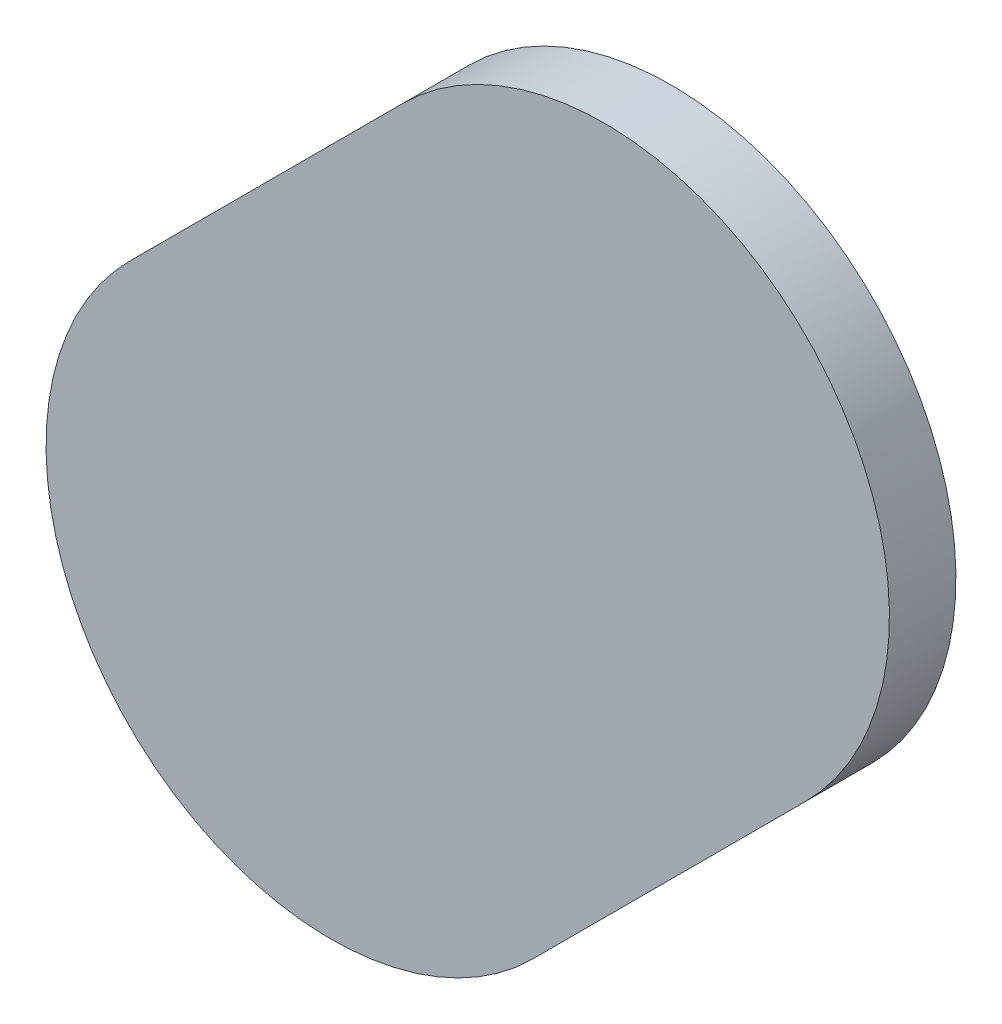
ISO-10303-21;
HEADER;
FILE_DESCRIPTION(('STEP AP214'),'2;1');
FILE_NAME('part.step','',(''),(''),'','','');
FILE_SCHEMA(('AUTOMOTIVE_DESIGN { 1 0 10303 214 1 1 1 1 }'));
ENDSEC;
DATA;
#1=APPLICATION_CONTEXT('core data for automotive mechanical design processes');
#2=APPLICATION_PROTOCOL_DEFINITION('international standard','automotive_design',2000,#1);
#3=PRODUCT_CONTEXT('',#1,'mechanical');
#4=PRODUCT('Part','Part','',(#3));
#5=PRODUCT_RELATED_PRODUCT_CATEGORY('part','',(#4));
#6=PRODUCT_DEFINITION_FORMATION('','',#4);
#7=PRODUCT_DEFINITION_CONTEXT('part definition',#1,'design');
#8=PRODUCT_DEFINITION('design','',#6,#7);
#9=PRODUCT_DEFINITION_SHAPE('','',#8);
#10=(LENGTH_UNIT() NAMED_UNIT(*) SI_UNIT(.MILLI.,.METRE.));
#11=(NAMED_UNIT(*) PLANE_ANGLE_UNIT() SI_UNIT($,.RADIAN.));
#12=(NAMED_UNIT(*) SI_UNIT($,.STERADIAN.) SOLID_ANGLE_UNIT());
#13=UNCERTAINTY_MEASURE_WITH_UNIT(LENGTH_MEASURE(1.E-05),#10,'distance_accuracy_value','');
#14=(GEOMETRIC_REPRESENTATION_CONTEXT(3) GLOBAL_UNCERTAINTY_ASSIGNED_CONTEXT((#13)) GLOBAL_UNIT_ASSIGNED_CONTEXT((#10,
#11,#12)) REPRESENTATION_CONTEXT('',''));
#15=CARTESIAN_POINT('',(0.,0.,0.));
#16=DIRECTION('',(0.,0.,1.));
#17=DIRECTION('',(1.,0.,0.));
#18=AXIS2_PLACEMENT_3D('',#15,#16,#17);
#19=CARTESIAN_POINT('',(132.205933,-112.443933,1.635));
#20=DIRECTION('',(0.,0.,1.));
#21=DIRECTION('',(1.,0.,0.));
#22=AXIS2_PLACEMENT_3D('',#19,#20,#21);
#23=PLANE('',#22);
#24=DIRECTION('',(-0.707106781186048,-0.707106781187048,0.));
#25=VECTOR('',#24,1.);
#26=CARTESIAN_POINT('',(132.205933,-112.443933,1.635));
#27=LINE('',#26,#25);
#28=CARTESIAN_POINT('',(132.205933,-112.443933,1.635));
#29=VERTEX_POINT('',#28);
#30=CARTESIAN_POINT('',(132.061933,-112.587933,1.635));
#31=VERTEX_POINT('',#30);
#32=EDGE_CURVE('E82',#29,#31,#27,.T.);
#33=ORIENTED_EDGE('',*,*,#32,.T.);
#34=CARTESIAN_POINT('',(132.1679995,-112.6939995,1.635));
#35=DIRECTION('',(0.,0.,1.));
#36=DIRECTION('',(-0.707106781186548,0.707106781186548,0.));
#37=AXIS2_PLACEMENT_3D('',#34,#35,#36);
#38=CIRCLE('',#37,0.150000682813);
#39=CARTESIAN_POINT('',(132.274066,-112.800066,1.635));
#40=VERTEX_POINT('',#39);
#41=EDGE_CURVE('E101',#31,#40,#38,.T.);
#42=ORIENTED_EDGE('',*,*,#41,.T.);
#43=DIRECTION('',(0.707106781186548,0.707106781186548,0.));
#44=VECTOR('',#43,1.);
#45=CARTESIAN_POINT('',(132.274066,-112.800066,1.635));
#46=LINE('',#45,#44);
#47=CARTESIAN_POINT('',(132.418066,-112.656066,1.635));
#48=VERTEX_POINT('',#47);
#49=EDGE_CURVE('E74',#40,#48,#46,.T.);
#50=ORIENTED_EDGE('',*,*,#49,.T.);
#51=CARTESIAN_POINT('',(132.3119995,-112.5499995,1.635));
#52=DIRECTION('',(0.,0.,1.));
#53=DIRECTION('',(0.707106781186548,-0.707106781186548,0.));
#54=AXIS2_PLACEMENT_3D('',#51,#52,#53);
#55=CIRCLE('',#54,0.150000682813);
#56=EDGE_CURVE('E11',#48,#29,#55,.T.);
#57=ORIENTED_EDGE('',*,*,#56,.T.);
#58=EDGE_LOOP('',(#33,#42,#50,#57));
#59=FACE_BOUND('',#58,.T.);
#60=ADVANCED_FACE('F17',(#59),#23,.T.);
#61=CARTESIAN_POINT('',(132.205933,-112.443933,1.6));
#62=DIRECTION('',(0.,0.,1.));
#63=DIRECTION('',(1.,0.,0.));
#64=AXIS2_PLACEMENT_3D('',#61,#62,#63);
#65=PLANE('',#64);
#66=CARTESIAN_POINT('',(132.3119995,-112.5499995,1.6));
#67=DIRECTION('',(0.,0.,1.));
#68=DIRECTION('',(0.707106781186548,-0.707106781186548,0.));
#69=AXIS2_PLACEMENT_3D('',#66,#67,#68);
#70=CIRCLE('',#69,0.150000682813);
#71=CARTESIAN_POINT('',(132.418066,-112.656066,1.6));
#72=VERTEX_POINT('',#71);
#73=CARTESIAN_POINT('',(132.205933,-112.443933,1.6));
#74=VERTEX_POINT('',#73);
#75=EDGE_CURVE('E25',#72,#74,#70,.T.);
#76=ORIENTED_EDGE('',*,*,#75,.F.);
#77=DIRECTION('',(0.707106781186548,0.707106781186548,0.));
#78=VECTOR('',#77,1.);
#79=CARTESIAN_POINT('',(132.274066,-112.800066,1.6));
#80=LINE('',#79,#78);
#81=CARTESIAN_POINT('',(132.274066,-112.800066,1.6));
#82=VERTEX_POINT('',#81);
#83=EDGE_CURVE('E105',#82,#72,#80,.T.);
#84=ORIENTED_EDGE('',*,*,#83,.F.);
#85=CARTESIAN_POINT('',(132.1679995,-112.6939995,1.6));
#86=DIRECTION('',(0.,0.,1.));
#87=DIRECTION('',(-0.707106781186548,0.707106781186548,0.));
#88=AXIS2_PLACEMENT_3D('',#85,#86,#87);
#89=CIRCLE('',#88,0.150000682813);
#90=CARTESIAN_POINT('',(132.061933,-112.587933,1.6));
#91=VERTEX_POINT('',#90);
#92=EDGE_CURVE('E84',#91,#82,#89,.T.);
#93=ORIENTED_EDGE('',*,*,#92,.F.);
#94=DIRECTION('',(-0.707106781186048,-0.707106781187048,0.));
#95=VECTOR('',#94,1.);
#96=CARTESIAN_POINT('',(132.205933,-112.443933,1.6));
#97=LINE('',#96,#95);
#98=EDGE_CURVE('E80',#74,#91,#97,.T.);
#99=ORIENTED_EDGE('',*,*,#98,.F.);
#100=EDGE_LOOP('',(#76,#84,#93,#99));
#101=FACE_BOUND('',#100,.T.);
#102=ADVANCED_FACE('F86',(#101),#65,.F.);
#103=CARTESIAN_POINT('',(132.3119995,-112.5499995,1.6));
#104=DIRECTION('',(0.,0.,-1.));
#105=DIRECTION('',(0.707106781186548,-0.707106781186548,0.));
#106=AXIS2_PLACEMENT_3D('',#103,#104,#105);
#107=CYLINDRICAL_SURFACE('',#106,0.150000682813);
#108=ORIENTED_EDGE('',*,*,#75,.T.);
#109=DIRECTION('',(0.,0.,1.));
#110=VECTOR('',#109,1.);
#111=CARTESIAN_POINT('',(132.205933,-112.443933,1.6));
#112=LINE('',#111,#110);
#113=EDGE_CURVE('E68',#74,#29,#112,.T.);
#114=ORIENTED_EDGE('',*,*,#113,.T.);
#115=ORIENTED_EDGE('',*,*,#56,.F.);
#116=DIRECTION('',(0.,0.,1.));
#117=VECTOR('',#116,1.);
#118=CARTESIAN_POINT('',(132.418066,-112.656066,1.6));
#119=LINE('',#118,#117);
#120=EDGE_CURVE('E71',#72,#48,#119,.T.);
#121=ORIENTED_EDGE('',*,*,#120,.F.);
#122=EDGE_LOOP('',(#108,#114,#115,#121));
#123=FACE_BOUND('',#122,.T.);
#124=ADVANCED_FACE('F67',(#123),#107,.T.);
#125=CARTESIAN_POINT('',(132.274066,-112.800066,1.6));
#126=DIRECTION('',(-0.707106781186548,0.707106781186548,0.));
#127=DIRECTION('',(0.,0.,1.));
#128=AXIS2_PLACEMENT_3D('',#125,#126,#127);
#129=PLANE('',#128);
#130=ORIENTED_EDGE('',*,*,#83,.T.);
#131=ORIENTED_EDGE('',*,*,#120,.T.);
#132=ORIENTED_EDGE('',*,*,#49,.F.);
#133=DIRECTION('',(0.,0.,1.));
#134=VECTOR('',#133,1.);
#135=CARTESIAN_POINT('',(132.274066,-112.800066,1.6));
#136=LINE('',#135,#134);
#137=EDGE_CURVE('E106',#82,#40,#136,.T.);
#138=ORIENTED_EDGE('',*,*,#137,.F.);
#139=EDGE_LOOP('',(#130,#131,#132,#138));
#140=FACE_BOUND('',#139,.T.);
#141=ADVANCED_FACE('F119',(#140),#129,.F.);
#142=CARTESIAN_POINT('',(132.1679995,-112.6939995,1.6));
#143=DIRECTION('',(0.,0.,-1.));
#144=DIRECTION('',(-0.707106781186548,0.707106781186548,0.));
#145=AXIS2_PLACEMENT_3D('',#142,#143,#144);
#146=CYLINDRICAL_SURFACE('',#145,0.150000682813);
#147=ORIENTED_EDGE('',*,*,#92,.T.);
#148=ORIENTED_EDGE('',*,*,#137,.T.);
#149=ORIENTED_EDGE('',*,*,#41,.F.);
#150=DIRECTION('',(0.,0.,1.));
#151=VECTOR('',#150,1.);
#152=CARTESIAN_POINT('',(132.061933,-112.587933,1.6));
#153=LINE('',#152,#151);
#154=EDGE_CURVE('E90',#91,#31,#153,.T.);
#155=ORIENTED_EDGE('',*,*,#154,.F.);
#156=EDGE_LOOP('',(#147,#148,#149,#155));
#157=FACE_BOUND('',#156,.T.);
#158=ADVANCED_FACE('F121',(#157),#146,.T.);
#159=CARTESIAN_POINT('',(132.205933,-112.443933,1.6));
#160=DIRECTION('',(0.707106781187048,-0.707106781186048,0.));
#161=DIRECTION('',(0.,0.,-1.));
#162=AXIS2_PLACEMENT_3D('',#159,#160,#161);
#163=PLANE('',#162);
#164=ORIENTED_EDGE('',*,*,#98,.T.);
#165=ORIENTED_EDGE('',*,*,#154,.T.);
#166=ORIENTED_EDGE('',*,*,#32,.F.);
#167=ORIENTED_EDGE('',*,*,#113,.F.);
#168=EDGE_LOOP('',(#164,#165,#166,#167));
#169=FACE_BOUND('',#168,.T.);
#170=ADVANCED_FACE('F78',(#169),#163,.F.);
#171=CLOSED_SHELL('',(#60,#102,#124,#141,#158,#170));
#172=MANIFOLD_SOLID_BREP('B1',#171);
#173=ADVANCED_BREP_SHAPE_REPRESENTATION('',(#18,#172),#14);
#174=SHAPE_DEFINITION_REPRESENTATION(#9,#173);
ENDSEC;
END-ISO-10303-21;
